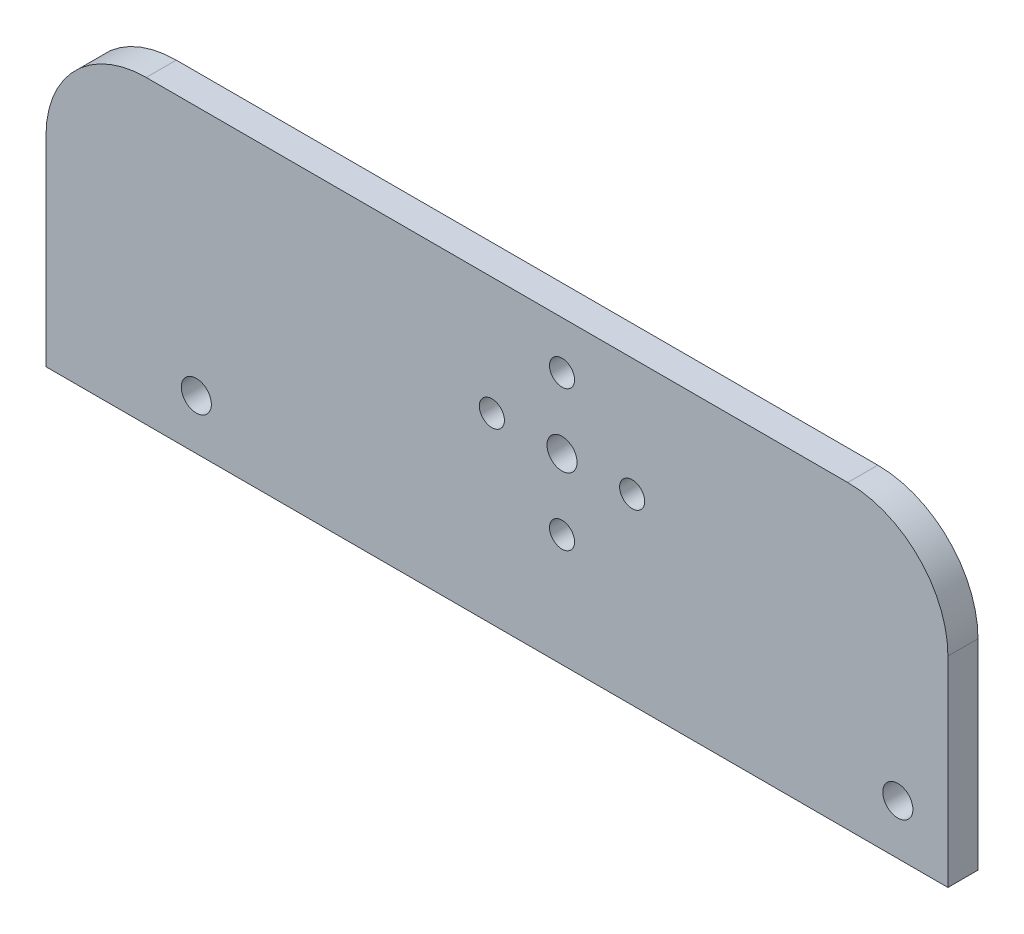
ISO-10303-21;
HEADER;
FILE_DESCRIPTION(('STEP AP214'),'2;1');
FILE_NAME('part.step','',(''),(''),'','','');
FILE_SCHEMA(('AUTOMOTIVE_DESIGN { 1 0 10303 214 1 1 1 1 }'));
ENDSEC;
DATA;
#1=APPLICATION_CONTEXT('core data for automotive mechanical design processes');
#2=APPLICATION_PROTOCOL_DEFINITION('international standard','automotive_design',2000,#1);
#3=PRODUCT_CONTEXT('',#1,'mechanical');
#4=PRODUCT('Part','Part','',(#3));
#5=PRODUCT_RELATED_PRODUCT_CATEGORY('part','',(#4));
#6=PRODUCT_DEFINITION_FORMATION('','',#4);
#7=PRODUCT_DEFINITION_CONTEXT('part definition',#1,'design');
#8=PRODUCT_DEFINITION('design','',#6,#7);
#9=PRODUCT_DEFINITION_SHAPE('','',#8);
#10=(LENGTH_UNIT() NAMED_UNIT(*) SI_UNIT(.MILLI.,.METRE.));
#11=(NAMED_UNIT(*) PLANE_ANGLE_UNIT() SI_UNIT($,.RADIAN.));
#12=(NAMED_UNIT(*) SI_UNIT($,.STERADIAN.) SOLID_ANGLE_UNIT());
#13=UNCERTAINTY_MEASURE_WITH_UNIT(LENGTH_MEASURE(1.E-05),#10,'distance_accuracy_value','');
#14=(GEOMETRIC_REPRESENTATION_CONTEXT(3) GLOBAL_UNCERTAINTY_ASSIGNED_CONTEXT((#13)) GLOBAL_UNIT_ASSIGNED_CONTEXT((#10,
#11,#12)) REPRESENTATION_CONTEXT('',''));
#15=CARTESIAN_POINT('',(0.,0.,0.));
#16=DIRECTION('',(0.,0.,1.));
#17=DIRECTION('',(1.,0.,0.));
#18=AXIS2_PLACEMENT_3D('',#15,#16,#17);
#19=CARTESIAN_POINT('',(45.,15.,3.));
#20=DIRECTION('',(-1.,0.,0.));
#21=DIRECTION('',(0.,-1.,0.));
#22=AXIS2_PLACEMENT_3D('',#19,#20,#21);
#23=PLANE('',#22);
#24=DIRECTION('',(0.,1.,0.));
#25=VECTOR('',#24,1.);
#26=CARTESIAN_POINT('',(45.,15.,0.));
#27=LINE('',#26,#25);
#28=CARTESIAN_POINT('',(45.,-15.,0.));
#29=VERTEX_POINT('',#28);
#30=CARTESIAN_POINT('',(45.,5.,0.));
#31=VERTEX_POINT('',#30);
#32=EDGE_CURVE('E122',#29,#31,#27,.T.);
#33=ORIENTED_EDGE('',*,*,#32,.T.);
#34=DIRECTION('',(0.,0.,-1.));
#35=VECTOR('',#34,1.);
#36=CARTESIAN_POINT('',(45.,5.,3.));
#37=LINE('',#36,#35);
#38=CARTESIAN_POINT('',(45.,5.,3.));
#39=VERTEX_POINT('',#38);
#40=EDGE_CURVE('E62',#31,#39,#37,.F.);
#41=ORIENTED_EDGE('',*,*,#40,.T.);
#42=DIRECTION('',(0.,1.,0.));
#43=VECTOR('',#42,1.);
#44=CARTESIAN_POINT('',(45.,15.,3.));
#45=LINE('',#44,#43);
#46=CARTESIAN_POINT('',(45.,-15.,3.));
#47=VERTEX_POINT('',#46);
#48=EDGE_CURVE('E134',#47,#39,#45,.T.);
#49=ORIENTED_EDGE('',*,*,#48,.F.);
#50=DIRECTION('',(0.,0.,-1.));
#51=VECTOR('',#50,1.);
#52=CARTESIAN_POINT('',(45.,-15.,3.));
#53=LINE('',#52,#51);
#54=EDGE_CURVE('E112',#47,#29,#53,.T.);
#55=ORIENTED_EDGE('',*,*,#54,.T.);
#56=EDGE_LOOP('',(#33,#41,#49,#55));
#57=FACE_BOUND('',#56,.T.);
#58=ADVANCED_FACE('F38',(#57),#23,.F.);
#59=CARTESIAN_POINT('',(-45.,15.,3.));
#60=DIRECTION('',(0.,-1.,0.));
#61=DIRECTION('',(0.,0.,-1.));
#62=AXIS2_PLACEMENT_3D('',#59,#60,#61);
#63=PLANE('',#62);
#64=DIRECTION('',(-1.,0.,0.));
#65=VECTOR('',#64,1.);
#66=CARTESIAN_POINT('',(-45.,15.,3.));
#67=LINE('',#66,#65);
#68=CARTESIAN_POINT('',(35.,15.,3.));
#69=VERTEX_POINT('',#68);
#70=CARTESIAN_POINT('',(-35.,15.,3.));
#71=VERTEX_POINT('',#70);
#72=EDGE_CURVE('E101',#69,#71,#67,.T.);
#73=ORIENTED_EDGE('',*,*,#72,.F.);
#74=DIRECTION('',(0.,0.,-1.));
#75=VECTOR('',#74,1.);
#76=CARTESIAN_POINT('',(35.,15.,3.));
#77=LINE('',#76,#75);
#78=CARTESIAN_POINT('',(35.,15.,0.));
#79=VERTEX_POINT('',#78);
#80=EDGE_CURVE('E138',#69,#79,#77,.T.);
#81=ORIENTED_EDGE('',*,*,#80,.T.);
#82=DIRECTION('',(-1.,0.,0.));
#83=VECTOR('',#82,1.);
#84=CARTESIAN_POINT('',(-45.,15.,0.));
#85=LINE('',#84,#83);
#86=CARTESIAN_POINT('',(-35.,15.,0.));
#87=VERTEX_POINT('',#86);
#88=EDGE_CURVE('E125',#79,#87,#85,.T.);
#89=ORIENTED_EDGE('',*,*,#88,.T.);
#90=DIRECTION('',(0.,0.,-1.));
#91=VECTOR('',#90,1.);
#92=CARTESIAN_POINT('',(-35.,15.,3.));
#93=LINE('',#92,#91);
#94=EDGE_CURVE('E111',#87,#71,#93,.F.);
#95=ORIENTED_EDGE('',*,*,#94,.T.);
#96=EDGE_LOOP('',(#73,#81,#89,#95));
#97=FACE_BOUND('',#96,.T.);
#98=ADVANCED_FACE('F157',(#97),#63,.F.);
#99=CARTESIAN_POINT('',(-45.,15.,3.));
#100=DIRECTION('',(1.,0.,0.));
#101=DIRECTION('',(0.,1.,0.));
#102=AXIS2_PLACEMENT_3D('',#99,#100,#101);
#103=PLANE('',#102);
#104=DIRECTION('',(0.,-1.,0.));
#105=VECTOR('',#104,1.);
#106=CARTESIAN_POINT('',(-45.,15.,3.));
#107=LINE('',#106,#105);
#108=CARTESIAN_POINT('',(-45.,5.,3.));
#109=VERTEX_POINT('',#108);
#110=CARTESIAN_POINT('',(-45.,-15.,3.));
#111=VERTEX_POINT('',#110);
#112=EDGE_CURVE('E92',#109,#111,#107,.T.);
#113=ORIENTED_EDGE('',*,*,#112,.F.);
#114=DIRECTION('',(0.,0.,-1.));
#115=VECTOR('',#114,1.);
#116=CARTESIAN_POINT('',(-45.,5.,3.));
#117=LINE('',#116,#115);
#118=CARTESIAN_POINT('',(-45.,5.,0.));
#119=VERTEX_POINT('',#118);
#120=EDGE_CURVE('E11',#109,#119,#117,.T.);
#121=ORIENTED_EDGE('',*,*,#120,.T.);
#122=DIRECTION('',(0.,-1.,0.));
#123=VECTOR('',#122,1.);
#124=CARTESIAN_POINT('',(-45.,15.,0.));
#125=LINE('',#124,#123);
#126=CARTESIAN_POINT('',(-45.,-15.,0.));
#127=VERTEX_POINT('',#126);
#128=EDGE_CURVE('E107',#119,#127,#125,.T.);
#129=ORIENTED_EDGE('',*,*,#128,.T.);
#130=DIRECTION('',(0.,0.,-1.));
#131=VECTOR('',#130,1.);
#132=CARTESIAN_POINT('',(-45.,-15.,3.));
#133=LINE('',#132,#131);
#134=EDGE_CURVE('E104',#111,#127,#133,.T.);
#135=ORIENTED_EDGE('',*,*,#134,.F.);
#136=EDGE_LOOP('',(#113,#121,#129,#135));
#137=FACE_BOUND('',#136,.T.);
#138=ADVANCED_FACE('F105',(#137),#103,.F.);
#139=CARTESIAN_POINT('',(-45.,-15.,3.));
#140=DIRECTION('',(0.,1.,0.));
#141=DIRECTION('',(0.,0.,1.));
#142=AXIS2_PLACEMENT_3D('',#139,#140,#141);
#143=PLANE('',#142);
#144=DIRECTION('',(1.,0.,0.));
#145=VECTOR('',#144,1.);
#146=CARTESIAN_POINT('',(-45.,-15.,0.));
#147=LINE('',#146,#145);
#148=EDGE_CURVE('E132',#127,#29,#147,.T.);
#149=ORIENTED_EDGE('',*,*,#148,.T.);
#150=ORIENTED_EDGE('',*,*,#54,.F.);
#151=DIRECTION('',(1.,0.,0.));
#152=VECTOR('',#151,1.);
#153=CARTESIAN_POINT('',(-45.,-15.,3.));
#154=LINE('',#153,#152);
#155=EDGE_CURVE('E96',#111,#47,#154,.T.);
#156=ORIENTED_EDGE('',*,*,#155,.F.);
#157=ORIENTED_EDGE('',*,*,#134,.T.);
#158=EDGE_LOOP('',(#149,#150,#156,#157));
#159=FACE_BOUND('',#158,.T.);
#160=ADVANCED_FACE('F114',(#159),#143,.F.);
#161=CARTESIAN_POINT('',(0.,0.,3.));
#162=DIRECTION('',(0.,0.,1.));
#163=DIRECTION('',(1.,0.,0.));
#164=AXIS2_PLACEMENT_3D('',#161,#162,#163);
#165=PLANE('',#164);
#166=CARTESIAN_POINT('',(-29.9999999999994,-10.0000000000001,3.));
#167=DIRECTION('',(0.,0.,1.));
#168=DIRECTION('',(1.,0.,0.));
#169=AXIS2_PLACEMENT_3D('',#166,#167,#168);
#170=CIRCLE('',#169,1.50000000000058);
#171=CARTESIAN_POINT('',(-28.4999999999988,-10.0000000000001,3.));
#172=VERTEX_POINT('',#171);
#173=EDGE_CURVE('E215',#172,#172,#170,.T.);
#174=ORIENTED_EDGE('',*,*,#173,.F.);
#175=EDGE_LOOP('',(#174));
#176=FACE_BOUND('',#175,.T.);
#177=CARTESIAN_POINT('',(40.0000000000007,-10.0000000000007,3.));
#178=DIRECTION('',(0.,0.,1.));
#179=DIRECTION('',(1.,0.,0.));
#180=AXIS2_PLACEMENT_3D('',#177,#178,#179);
#181=CIRCLE('',#180,1.50000000000075);
#182=CARTESIAN_POINT('',(41.5000000000014,-10.0000000000007,3.));
#183=VERTEX_POINT('',#182);
#184=EDGE_CURVE('E204',#183,#183,#181,.T.);
#185=ORIENTED_EDGE('',*,*,#184,.F.);
#186=EDGE_LOOP('',(#185));
#187=FACE_BOUND('',#186,.T.);
#188=CARTESIAN_POINT('',(-0.507728980191018,3.2369671057634,3.));
#189=DIRECTION('',(0.,0.,1.));
#190=DIRECTION('',(1.,0.,0.));
#191=AXIS2_PLACEMENT_3D('',#188,#189,#190);
#192=CIRCLE('',#191,1.25);
#193=CARTESIAN_POINT('',(0.742271019808982,3.2369671057634,3.));
#194=VERTEX_POINT('',#193);
#195=EDGE_CURVE('E175',#194,#194,#192,.T.);
#196=ORIENTED_EDGE('',*,*,#195,.F.);
#197=EDGE_LOOP('',(#196));
#198=FACE_BOUND('',#197,.T.);
#199=CARTESIAN_POINT('',(6.49227101980898,-3.76303289423659,3.));
#200=DIRECTION('',(0.,0.,1.));
#201=DIRECTION('',(1.,0.,0.));
#202=AXIS2_PLACEMENT_3D('',#199,#200,#201);
#203=CIRCLE('',#202,1.24999999999999);
#204=CARTESIAN_POINT('',(7.74227101980897,-3.76303289423659,3.));
#205=VERTEX_POINT('',#204);
#206=EDGE_CURVE('E179',#205,#205,#203,.T.);
#207=ORIENTED_EDGE('',*,*,#206,.F.);
#208=EDGE_LOOP('',(#207));
#209=FACE_BOUND('',#208,.T.);
#210=CARTESIAN_POINT('',(6.49227101980898,10.2369671057634,3.));
#211=DIRECTION('',(0.,0.,1.));
#212=DIRECTION('',(1.,0.,0.));
#213=AXIS2_PLACEMENT_3D('',#210,#211,#212);
#214=CIRCLE('',#213,1.25);
#215=CARTESIAN_POINT('',(7.74227101980898,10.2369671057634,3.));
#216=VERTEX_POINT('',#215);
#217=EDGE_CURVE('E183',#216,#216,#214,.T.);
#218=ORIENTED_EDGE('',*,*,#217,.F.);
#219=EDGE_LOOP('',(#218));
#220=FACE_BOUND('',#219,.T.);
#221=CARTESIAN_POINT('',(13.492271019809,3.23696710576341,3.));
#222=DIRECTION('',(0.,0.,1.));
#223=DIRECTION('',(1.,0.,0.));
#224=AXIS2_PLACEMENT_3D('',#221,#222,#223);
#225=CIRCLE('',#224,1.25);
#226=CARTESIAN_POINT('',(14.742271019809,3.23696710576341,3.));
#227=VERTEX_POINT('',#226);
#228=EDGE_CURVE('E187',#227,#227,#225,.T.);
#229=ORIENTED_EDGE('',*,*,#228,.F.);
#230=EDGE_LOOP('',(#229));
#231=FACE_BOUND('',#230,.T.);
#232=CARTESIAN_POINT('',(6.49227101980915,3.23696710576321,3.));
#233=DIRECTION('',(0.,0.,1.));
#234=DIRECTION('',(1.,0.,0.));
#235=AXIS2_PLACEMENT_3D('',#232,#233,#234);
#236=CIRCLE('',#235,1.5);
#237=CARTESIAN_POINT('',(7.99227101980915,3.23696710576321,3.));
#238=VERTEX_POINT('',#237);
#239=EDGE_CURVE('E126',#238,#238,#236,.T.);
#240=ORIENTED_EDGE('',*,*,#239,.F.);
#241=EDGE_LOOP('',(#240));
#242=FACE_BOUND('',#241,.T.);
#243=ORIENTED_EDGE('',*,*,#48,.T.);
#244=CARTESIAN_POINT('',(35.,5.,3.));
#245=DIRECTION('',(0.,0.,1.));
#246=DIRECTION('',(1.,0.,0.));
#247=AXIS2_PLACEMENT_3D('',#244,#245,#246);
#248=CIRCLE('',#247,10.);
#249=EDGE_CURVE('E47',#39,#69,#248,.T.);
#250=ORIENTED_EDGE('',*,*,#249,.T.);
#251=ORIENTED_EDGE('',*,*,#72,.T.);
#252=CARTESIAN_POINT('',(-35.,5.,3.));
#253=DIRECTION('',(0.,0.,1.));
#254=DIRECTION('',(1.,0.,0.));
#255=AXIS2_PLACEMENT_3D('',#252,#253,#254);
#256=CIRCLE('',#255,10.);
#257=EDGE_CURVE('E54',#71,#109,#256,.T.);
#258=ORIENTED_EDGE('',*,*,#257,.T.);
#259=ORIENTED_EDGE('',*,*,#112,.T.);
#260=ORIENTED_EDGE('',*,*,#155,.T.);
#261=EDGE_LOOP('',(#243,#250,#251,#258,#259,#260));
#262=FACE_BOUND('',#261,.T.);
#263=ADVANCED_FACE('F94',(#176,#187,#198,#209,#220,#231,#242,#262),#165,.T.);
#264=CARTESIAN_POINT('',(0.,0.,0.));
#265=DIRECTION('',(0.,0.,1.));
#266=DIRECTION('',(1.,0.,0.));
#267=AXIS2_PLACEMENT_3D('',#264,#265,#266);
#268=PLANE('',#267);
#269=CARTESIAN_POINT('',(-29.9999999999994,-10.0000000000001,0.));
#270=DIRECTION('',(0.,0.,-1.));
#271=DIRECTION('',(-1.,0.,0.));
#272=AXIS2_PLACEMENT_3D('',#269,#270,#271);
#273=CIRCLE('',#272,1.50000000000058);
#274=CARTESIAN_POINT('',(-31.5,-10.0000000000001,0.));
#275=VERTEX_POINT('',#274);
#276=EDGE_CURVE('E219',#275,#275,#273,.T.);
#277=ORIENTED_EDGE('',*,*,#276,.F.);
#278=EDGE_LOOP('',(#277));
#279=FACE_BOUND('',#278,.T.);
#280=CARTESIAN_POINT('',(40.0000000000007,-10.0000000000007,0.));
#281=DIRECTION('',(0.,0.,-1.));
#282=DIRECTION('',(-1.,0.,0.));
#283=AXIS2_PLACEMENT_3D('',#280,#281,#282);
#284=CIRCLE('',#283,1.50000000000075);
#285=CARTESIAN_POINT('',(38.4999999999999,-10.0000000000007,0.));
#286=VERTEX_POINT('',#285);
#287=EDGE_CURVE('E211',#286,#286,#284,.T.);
#288=ORIENTED_EDGE('',*,*,#287,.F.);
#289=EDGE_LOOP('',(#288));
#290=FACE_BOUND('',#289,.T.);
#291=CARTESIAN_POINT('',(-0.507728980191018,3.2369671057634,0.));
#292=DIRECTION('',(0.,0.,-1.));
#293=DIRECTION('',(-1.,0.,0.));
#294=AXIS2_PLACEMENT_3D('',#291,#292,#293);
#295=CIRCLE('',#294,1.25);
#296=CARTESIAN_POINT('',(-1.75772898019102,3.2369671057634,0.));
#297=VERTEX_POINT('',#296);
#298=EDGE_CURVE('E200',#297,#297,#295,.T.);
#299=ORIENTED_EDGE('',*,*,#298,.F.);
#300=EDGE_LOOP('',(#299));
#301=FACE_BOUND('',#300,.T.);
#302=CARTESIAN_POINT('',(6.49227101980898,-3.76303289423659,0.));
#303=DIRECTION('',(0.,0.,-1.));
#304=DIRECTION('',(-1.,0.,0.));
#305=AXIS2_PLACEMENT_3D('',#302,#303,#304);
#306=CIRCLE('',#305,1.24999999999999);
#307=CARTESIAN_POINT('',(5.24227101980899,-3.76303289423659,0.));
#308=VERTEX_POINT('',#307);
#309=EDGE_CURVE('E196',#308,#308,#306,.T.);
#310=ORIENTED_EDGE('',*,*,#309,.F.);
#311=EDGE_LOOP('',(#310));
#312=FACE_BOUND('',#311,.T.);
#313=CARTESIAN_POINT('',(6.49227101980898,10.2369671057634,0.));
#314=DIRECTION('',(0.,0.,-1.));
#315=DIRECTION('',(-1.,0.,0.));
#316=AXIS2_PLACEMENT_3D('',#313,#314,#315);
#317=CIRCLE('',#316,1.25);
#318=CARTESIAN_POINT('',(5.24227101980898,10.2369671057634,0.));
#319=VERTEX_POINT('',#318);
#320=EDGE_CURVE('E192',#319,#319,#317,.T.);
#321=ORIENTED_EDGE('',*,*,#320,.F.);
#322=EDGE_LOOP('',(#321));
#323=FACE_BOUND('',#322,.T.);
#324=CARTESIAN_POINT('',(13.492271019809,3.23696710576341,0.));
#325=DIRECTION('',(0.,0.,-1.));
#326=DIRECTION('',(-1.,0.,0.));
#327=AXIS2_PLACEMENT_3D('',#324,#325,#326);
#328=CIRCLE('',#327,1.25);
#329=CARTESIAN_POINT('',(12.242271019809,3.23696710576341,0.));
#330=VERTEX_POINT('',#329);
#331=EDGE_CURVE('E191',#330,#330,#328,.T.);
#332=ORIENTED_EDGE('',*,*,#331,.F.);
#333=EDGE_LOOP('',(#332));
#334=FACE_BOUND('',#333,.T.);
#335=CARTESIAN_POINT('',(6.49227101980915,3.23696710576321,0.));
#336=DIRECTION('',(0.,0.,-1.));
#337=DIRECTION('',(-1.,0.,0.));
#338=AXIS2_PLACEMENT_3D('',#335,#336,#337);
#339=CIRCLE('',#338,1.5);
#340=CARTESIAN_POINT('',(4.99227101980915,3.23696710576321,0.));
#341=VERTEX_POINT('',#340);
#342=EDGE_CURVE('E171',#341,#341,#339,.T.);
#343=ORIENTED_EDGE('',*,*,#342,.F.);
#344=EDGE_LOOP('',(#343));
#345=FACE_BOUND('',#344,.T.);
#346=ORIENTED_EDGE('',*,*,#88,.F.);
#347=CARTESIAN_POINT('',(35.,5.,0.));
#348=DIRECTION('',(0.,0.,1.));
#349=DIRECTION('',(1.,0.,0.));
#350=AXIS2_PLACEMENT_3D('',#347,#348,#349);
#351=CIRCLE('',#350,10.);
#352=EDGE_CURVE('E145',#79,#31,#351,.F.);
#353=ORIENTED_EDGE('',*,*,#352,.T.);
#354=ORIENTED_EDGE('',*,*,#32,.F.);
#355=ORIENTED_EDGE('',*,*,#148,.F.);
#356=ORIENTED_EDGE('',*,*,#128,.F.);
#357=CARTESIAN_POINT('',(-35.,5.,0.));
#358=DIRECTION('',(0.,0.,1.));
#359=DIRECTION('',(1.,0.,0.));
#360=AXIS2_PLACEMENT_3D('',#357,#358,#359);
#361=CIRCLE('',#360,10.);
#362=EDGE_CURVE('E142',#119,#87,#361,.F.);
#363=ORIENTED_EDGE('',*,*,#362,.T.);
#364=EDGE_LOOP('',(#346,#353,#354,#355,#356,#363));
#365=FACE_BOUND('',#364,.T.);
#366=ADVANCED_FACE('F164',(#279,#290,#301,#312,#323,#334,#345,#365),#268,.F.);
#367=CARTESIAN_POINT('',(6.49227101980915,3.23696710576321,10.));
#368=DIRECTION('',(0.,0.,-1.));
#369=DIRECTION('',(-1.,0.,0.));
#370=AXIS2_PLACEMENT_3D('',#367,#368,#369);
#371=CYLINDRICAL_SURFACE('',#370,1.5);
#372=ORIENTED_EDGE('',*,*,#239,.T.);
#373=EDGE_LOOP('',(#372));
#374=FACE_BOUND('',#373,.T.);
#375=ORIENTED_EDGE('',*,*,#342,.T.);
#376=EDGE_LOOP('',(#375));
#377=FACE_BOUND('',#376,.T.);
#378=ADVANCED_FACE('F228',(#374,#377),#371,.F.);
#379=CARTESIAN_POINT('',(13.492271019809,3.23696710576341,10.));
#380=DIRECTION('',(0.,0.,-1.));
#381=DIRECTION('',(-1.,0.,0.));
#382=AXIS2_PLACEMENT_3D('',#379,#380,#381);
#383=CYLINDRICAL_SURFACE('',#382,1.25);
#384=ORIENTED_EDGE('',*,*,#228,.T.);
#385=EDGE_LOOP('',(#384));
#386=FACE_BOUND('',#385,.T.);
#387=ORIENTED_EDGE('',*,*,#331,.T.);
#388=EDGE_LOOP('',(#387));
#389=FACE_BOUND('',#388,.T.);
#390=ADVANCED_FACE('F243',(#386,#389),#383,.F.);
#391=CARTESIAN_POINT('',(6.49227101980898,10.2369671057634,10.));
#392=DIRECTION('',(0.,0.,-1.));
#393=DIRECTION('',(-1.,0.,0.));
#394=AXIS2_PLACEMENT_3D('',#391,#392,#393);
#395=CYLINDRICAL_SURFACE('',#394,1.25);
#396=ORIENTED_EDGE('',*,*,#217,.T.);
#397=EDGE_LOOP('',(#396));
#398=FACE_BOUND('',#397,.T.);
#399=ORIENTED_EDGE('',*,*,#320,.T.);
#400=EDGE_LOOP('',(#399));
#401=FACE_BOUND('',#400,.T.);
#402=ADVANCED_FACE('F250',(#398,#401),#395,.F.);
#403=CARTESIAN_POINT('',(6.49227101980898,-3.76303289423659,10.));
#404=DIRECTION('',(0.,0.,-1.));
#405=DIRECTION('',(-1.,0.,0.));
#406=AXIS2_PLACEMENT_3D('',#403,#404,#405);
#407=CYLINDRICAL_SURFACE('',#406,1.24999999999999);
#408=ORIENTED_EDGE('',*,*,#206,.T.);
#409=EDGE_LOOP('',(#408));
#410=FACE_BOUND('',#409,.T.);
#411=ORIENTED_EDGE('',*,*,#309,.T.);
#412=EDGE_LOOP('',(#411));
#413=FACE_BOUND('',#412,.T.);
#414=ADVANCED_FACE('F278',(#410,#413),#407,.F.);
#415=CARTESIAN_POINT('',(-0.507728980191018,3.2369671057634,10.));
#416=DIRECTION('',(0.,0.,-1.));
#417=DIRECTION('',(-1.,0.,0.));
#418=AXIS2_PLACEMENT_3D('',#415,#416,#417);
#419=CYLINDRICAL_SURFACE('',#418,1.25);
#420=ORIENTED_EDGE('',*,*,#195,.T.);
#421=EDGE_LOOP('',(#420));
#422=FACE_BOUND('',#421,.T.);
#423=ORIENTED_EDGE('',*,*,#298,.T.);
#424=EDGE_LOOP('',(#423));
#425=FACE_BOUND('',#424,.T.);
#426=ADVANCED_FACE('F274',(#422,#425),#419,.F.);
#427=CARTESIAN_POINT('',(40.0000000000007,-10.0000000000007,10.));
#428=DIRECTION('',(0.,0.,-1.));
#429=DIRECTION('',(-1.,0.,0.));
#430=AXIS2_PLACEMENT_3D('',#427,#428,#429);
#431=CYLINDRICAL_SURFACE('',#430,1.50000000000075);
#432=ORIENTED_EDGE('',*,*,#184,.T.);
#433=EDGE_LOOP('',(#432));
#434=FACE_BOUND('',#433,.T.);
#435=ORIENTED_EDGE('',*,*,#287,.T.);
#436=EDGE_LOOP('',(#435));
#437=FACE_BOUND('',#436,.T.);
#438=ADVANCED_FACE('F269',(#434,#437),#431,.F.);
#439=CARTESIAN_POINT('',(-29.9999999999994,-10.0000000000001,10.));
#440=DIRECTION('',(0.,0.,-1.));
#441=DIRECTION('',(-1.,0.,0.));
#442=AXIS2_PLACEMENT_3D('',#439,#440,#441);
#443=CYLINDRICAL_SURFACE('',#442,1.50000000000058);
#444=ORIENTED_EDGE('',*,*,#173,.T.);
#445=EDGE_LOOP('',(#444));
#446=FACE_BOUND('',#445,.T.);
#447=ORIENTED_EDGE('',*,*,#276,.T.);
#448=EDGE_LOOP('',(#447));
#449=FACE_BOUND('',#448,.T.);
#450=ADVANCED_FACE('F224',(#446,#449),#443,.F.);
#451=CARTESIAN_POINT('',(35.,5.,3.));
#452=DIRECTION('',(0.,0.,-1.));
#453=DIRECTION('',(-1.,0.,0.));
#454=AXIS2_PLACEMENT_3D('',#451,#452,#453);
#455=CYLINDRICAL_SURFACE('',#454,10.);
#456=ORIENTED_EDGE('',*,*,#249,.F.);
#457=ORIENTED_EDGE('',*,*,#40,.F.);
#458=ORIENTED_EDGE('',*,*,#352,.F.);
#459=ORIENTED_EDGE('',*,*,#80,.F.);
#460=EDGE_LOOP('',(#456,#457,#458,#459));
#461=FACE_BOUND('',#460,.T.);
#462=ADVANCED_FACE('F161',(#461),#455,.T.);
#463=CARTESIAN_POINT('',(-35.,5.,3.));
#464=DIRECTION('',(0.,0.,-1.));
#465=DIRECTION('',(-1.,0.,0.));
#466=AXIS2_PLACEMENT_3D('',#463,#464,#465);
#467=CYLINDRICAL_SURFACE('',#466,10.);
#468=ORIENTED_EDGE('',*,*,#257,.F.);
#469=ORIENTED_EDGE('',*,*,#94,.F.);
#470=ORIENTED_EDGE('',*,*,#362,.F.);
#471=ORIENTED_EDGE('',*,*,#120,.F.);
#472=EDGE_LOOP('',(#468,#469,#470,#471));
#473=FACE_BOUND('',#472,.T.);
#474=ADVANCED_FACE('F40',(#473),#467,.T.);
#475=CLOSED_SHELL('',(#58,#98,#138,#160,#263,#366,#378,#390,#402,#414,#426,#438,#450,#462,#474));
#476=MANIFOLD_SOLID_BREP('B2',#475);
#477=ADVANCED_BREP_SHAPE_REPRESENTATION('',(#18,#476),#14);
#478=SHAPE_DEFINITION_REPRESENTATION(#9,#477);
ENDSEC;
END-ISO-10303-21;
